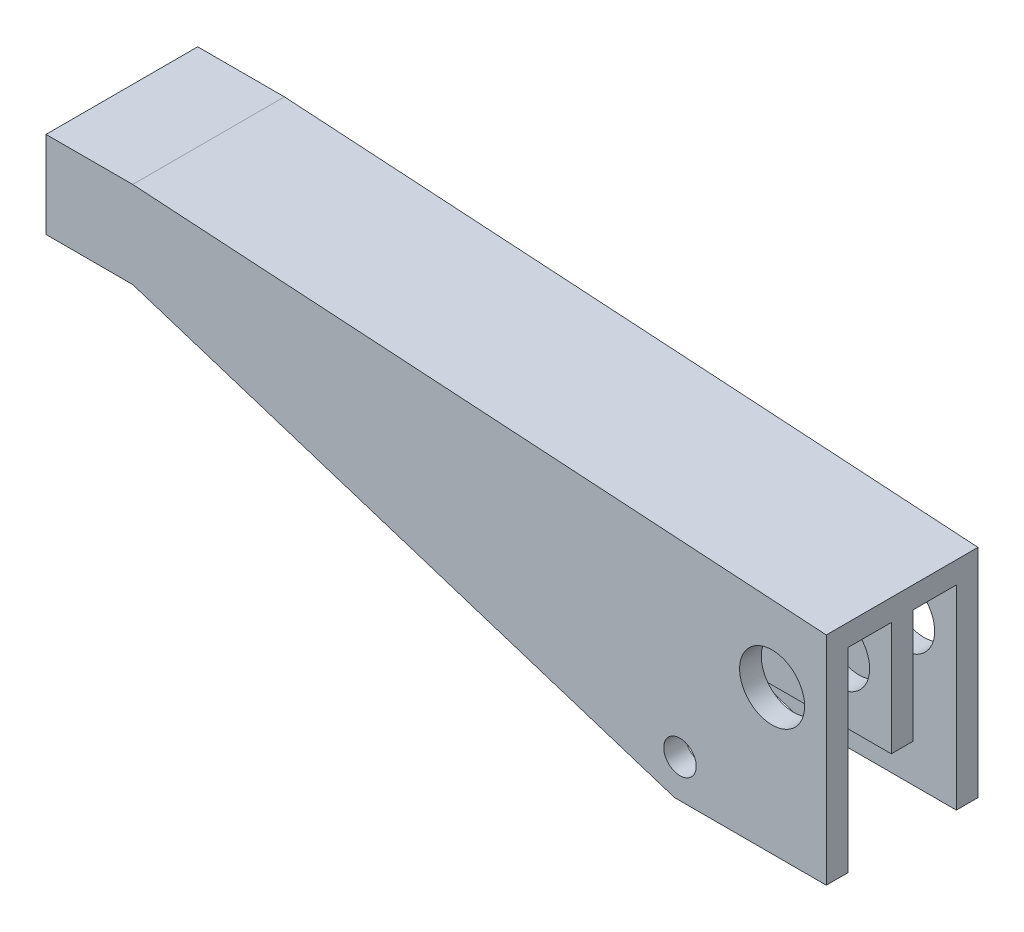
ISO-10303-21;
HEADER;
FILE_DESCRIPTION(('STEP AP214'),'2;1');
FILE_NAME('part.step','',(''),(''),'','','');
FILE_SCHEMA(('AUTOMOTIVE_DESIGN { 1 0 10303 214 1 1 1 1 }'));
ENDSEC;
DATA;
#1=APPLICATION_CONTEXT('core data for automotive mechanical design processes');
#2=APPLICATION_PROTOCOL_DEFINITION('international standard','automotive_design',2000,#1);
#3=PRODUCT_CONTEXT('',#1,'mechanical');
#4=PRODUCT('Part','Part','',(#3));
#5=PRODUCT_RELATED_PRODUCT_CATEGORY('part','',(#4));
#6=PRODUCT_DEFINITION_FORMATION('','',#4);
#7=PRODUCT_DEFINITION_CONTEXT('part definition',#1,'design');
#8=PRODUCT_DEFINITION('design','',#6,#7);
#9=PRODUCT_DEFINITION_SHAPE('','',#8);
#10=(LENGTH_UNIT() NAMED_UNIT(*) SI_UNIT(.MILLI.,.METRE.));
#11=(NAMED_UNIT(*) PLANE_ANGLE_UNIT() SI_UNIT($,.RADIAN.));
#12=(NAMED_UNIT(*) SI_UNIT($,.STERADIAN.) SOLID_ANGLE_UNIT());
#13=UNCERTAINTY_MEASURE_WITH_UNIT(LENGTH_MEASURE(1.E-05),#10,'distance_accuracy_value','');
#14=(GEOMETRIC_REPRESENTATION_CONTEXT(3) GLOBAL_UNCERTAINTY_ASSIGNED_CONTEXT((#13)) GLOBAL_UNIT_ASSIGNED_CONTEXT((#10,
#11,#12)) REPRESENTATION_CONTEXT('',''));
#15=CARTESIAN_POINT('',(0.,0.,0.));
#16=DIRECTION('',(0.,0.,1.));
#17=DIRECTION('',(1.,0.,0.));
#18=AXIS2_PLACEMENT_3D('',#15,#16,#17);
#19=CARTESIAN_POINT('',(682.208658532502,291.408058522125,-2722.74909230805));
#20=DIRECTION('',(-0.0623782861551791,-0.998052578482889,0.));
#21=DIRECTION('',(0.998052578482889,-0.0623782861551791,0.));
#22=AXIS2_PLACEMENT_3D('',#19,#20,#21);
#23=PLANE('',#22);
#24=DIRECTION('',(0.,0.,1.));
#25=VECTOR('',#24,1.);
#26=CARTESIAN_POINT('',(754.344658532502,286.899558522125,-2722.74909230805));
#27=LINE('',#26,#25);
#28=CARTESIAN_POINT('',(754.344658532502,286.899558522125,-116.84));
#29=VERTEX_POINT('',#28);
#30=CARTESIAN_POINT('',(754.344658532502,286.899558522125,27.4319999999999));
#31=VERTEX_POINT('',#30);
#32=EDGE_CURVE('E271',#29,#31,#27,.T.);
#33=ORIENTED_EDGE('',*,*,#32,.T.);
#34=DIRECTION('',(-0.998052578482889,0.0623782861551791,0.));
#35=VECTOR('',#34,1.);
#36=CARTESIAN_POINT('',(682.208658532502,291.408058522125,27.4319999999999));
#37=LINE('',#36,#35);
#38=CARTESIAN_POINT('',(-1556.25939434065,431.312311826698,27.4319999999999));
#39=VERTEX_POINT('',#38);
#40=EDGE_CURVE('E229',#31,#39,#37,.T.);
#41=ORIENTED_EDGE('',*,*,#40,.T.);
#42=DIRECTION('',(0.,0.,1.));
#43=VECTOR('',#42,1.);
#44=CARTESIAN_POINT('',(-1556.25939434065,431.312311826698,-2722.74909230805));
#45=LINE('',#44,#43);
#46=CARTESIAN_POINT('',(-1556.25939434065,431.312311826698,-116.84));
#47=VERTEX_POINT('',#46);
#48=EDGE_CURVE('E289',#47,#39,#45,.T.);
#49=ORIENTED_EDGE('',*,*,#48,.F.);
#50=DIRECTION('',(-0.998052578482889,0.0623782861551791,0.));
#51=VECTOR('',#50,1.);
#52=CARTESIAN_POINT('',(682.208658532502,291.408058522125,-116.84));
#53=LINE('',#52,#51);
#54=EDGE_CURVE('E270',#29,#47,#53,.T.);
#55=ORIENTED_EDGE('',*,*,#54,.F.);
#56=EDGE_LOOP('',(#33,#41,#49,#55));
#57=FACE_BOUND('',#56,.T.);
#58=ADVANCED_FACE('F37',(#57),#23,.T.);
#59=CARTESIAN_POINT('',(-1556.25939434065,431.312311826698,-2722.74909230805));
#60=DIRECTION('',(0.,-1.,0.));
#61=DIRECTION('',(1.,0.,0.));
#62=AXIS2_PLACEMENT_3D('',#59,#60,#61);
#63=PLANE('',#62);
#64=ORIENTED_EDGE('',*,*,#48,.T.);
#65=DIRECTION('',(-1.,0.,0.));
#66=VECTOR('',#65,1.);
#67=CARTESIAN_POINT('',(-1556.25939434065,431.312311826698,27.4319999999999));
#68=LINE('',#67,#66);
#69=CARTESIAN_POINT('',(-1842.5513414675,431.312311826697,27.4319999999999));
#70=VERTEX_POINT('',#69);
#71=EDGE_CURVE('E227',#39,#70,#68,.T.);
#72=ORIENTED_EDGE('',*,*,#71,.T.);
#73=DIRECTION('',(0.,0.,1.));
#74=VECTOR('',#73,1.);
#75=CARTESIAN_POINT('',(-1842.5513414675,431.312311826697,-2722.74909230805));
#76=LINE('',#75,#74);
#77=CARTESIAN_POINT('',(-1842.5513414675,431.312311826697,-116.84));
#78=VERTEX_POINT('',#77);
#79=EDGE_CURVE('E293',#78,#70,#76,.T.);
#80=ORIENTED_EDGE('',*,*,#79,.F.);
#81=DIRECTION('',(-1.,0.,0.));
#82=VECTOR('',#81,1.);
#83=CARTESIAN_POINT('',(-1556.25939434065,431.312311826698,-116.84));
#84=LINE('',#83,#82);
#85=EDGE_CURVE('E267',#47,#78,#84,.T.);
#86=ORIENTED_EDGE('',*,*,#85,.F.);
#87=EDGE_LOOP('',(#64,#72,#80,#86));
#88=FACE_BOUND('',#87,.T.);
#89=ADVANCED_FACE('F356',(#88),#63,.T.);
#90=DIRECTION('',(-0.998052578482889,0.0623782861551791,0.));
#91=VECTOR('',#90,1.);
#92=CARTESIAN_POINT('',(682.208658532502,291.408058522125,99.5680000000002));
#93=LINE('',#92,#91);
#94=CARTESIAN_POINT('',(754.344658532502,286.899558522125,99.5679999999999));
#95=VERTEX_POINT('',#94);
#96=CARTESIAN_POINT('',(-1556.25939434065,431.312311826698,99.5680000000002));
#97=VERTEX_POINT('',#96);
#98=EDGE_CURVE('E224',#95,#97,#93,.T.);
#99=ORIENTED_EDGE('',*,*,#98,.F.);
#100=CARTESIAN_POINT('',(754.344658532502,286.899558522125,243.84));
#101=VERTEX_POINT('',#100);
#102=EDGE_CURVE('E288',#95,#101,#27,.T.);
#103=ORIENTED_EDGE('',*,*,#102,.T.);
#104=DIRECTION('',(-0.998052578482889,0.0623782861551791,0.));
#105=VECTOR('',#104,1.);
#106=CARTESIAN_POINT('',(682.208658532502,291.408058522125,243.84));
#107=LINE('',#106,#105);
#108=CARTESIAN_POINT('',(-1556.25939434065,431.312311826698,243.84));
#109=VERTEX_POINT('',#108);
#110=EDGE_CURVE('E263',#101,#109,#107,.T.);
#111=ORIENTED_EDGE('',*,*,#110,.T.);
#112=EDGE_CURVE('E292',#97,#109,#45,.T.);
#113=ORIENTED_EDGE('',*,*,#112,.F.);
#114=EDGE_LOOP('',(#99,#103,#111,#113));
#115=FACE_BOUND('',#114,.T.);
#116=ADVANCED_FACE('F411',(#115),#23,.T.);
#117=DIRECTION('',(-1.,0.,0.));
#118=VECTOR('',#117,1.);
#119=CARTESIAN_POINT('',(-1556.25939434065,431.312311826698,99.5680000000002));
#120=LINE('',#119,#118);
#121=CARTESIAN_POINT('',(-1842.5513414675,431.312311826697,99.5680000000001));
#122=VERTEX_POINT('',#121);
#123=EDGE_CURVE('E61',#97,#122,#120,.T.);
#124=ORIENTED_EDGE('',*,*,#123,.F.);
#125=ORIENTED_EDGE('',*,*,#112,.T.);
#126=DIRECTION('',(-1.,0.,0.));
#127=VECTOR('',#126,1.);
#128=CARTESIAN_POINT('',(-1556.25939434065,431.312311826698,243.84));
#129=LINE('',#128,#127);
#130=CARTESIAN_POINT('',(-1842.5513414675,431.312311826697,243.84));
#131=VERTEX_POINT('',#130);
#132=EDGE_CURVE('E11',#109,#131,#129,.T.);
#133=ORIENTED_EDGE('',*,*,#132,.T.);
#134=EDGE_CURVE('E285',#122,#131,#76,.T.);
#135=ORIENTED_EDGE('',*,*,#134,.F.);
#136=EDGE_LOOP('',(#124,#125,#133,#135));
#137=FACE_BOUND('',#136,.T.);
#138=ADVANCED_FACE('F403',(#137),#63,.T.);
#139=CARTESIAN_POINT('',(754.344658532502,-362.183688173303,-116.84));
#140=DIRECTION('',(0.,0.,1.));
#141=DIRECTION('',(1.,0.,0.));
#142=AXIS2_PLACEMENT_3D('',#139,#140,#141);
#143=PLANE('',#142);
#144=CARTESIAN_POINT('',(267.426658532502,-235.945688173303,-116.84));
#145=DIRECTION('',(0.,0.,1.));
#146=DIRECTION('',(1.,0.,0.));
#147=AXIS2_PLACEMENT_3D('',#144,#145,#146);
#148=CIRCLE('',#147,54.102);
#149=CARTESIAN_POINT('',(321.528658532502,-235.945688173303,-116.84));
#150=VERTEX_POINT('',#149);
#151=EDGE_CURVE('E382',#150,#150,#148,.T.);
#152=ORIENTED_EDGE('',*,*,#151,.F.);
#153=EDGE_LOOP('',(#152));
#154=FACE_BOUND('',#153,.T.);
#155=CARTESIAN_POINT('',(574.004658532502,117.690055217553,-116.84));
#156=DIRECTION('',(0.,0.,1.));
#157=DIRECTION('',(1.,0.,0.));
#158=AXIS2_PLACEMENT_3D('',#155,#156,#157);
#159=CIRCLE('',#158,108.204);
#160=CARTESIAN_POINT('',(682.208658532502,117.690055217553,-116.84));
#161=VERTEX_POINT('',#160);
#162=EDGE_CURVE('E205',#161,#161,#159,.T.);
#163=ORIENTED_EDGE('',*,*,#162,.F.);
#164=EDGE_LOOP('',(#163));
#165=FACE_BOUND('',#164,.T.);
#166=DIRECTION('',(0.,1.,0.));
#167=VECTOR('',#166,1.);
#168=CARTESIAN_POINT('',(754.344658532502,-362.183688173303,-116.84));
#169=LINE('',#168,#167);
#170=CARTESIAN_POINT('',(754.344658532502,-362.183688173303,-116.84));
#171=VERTEX_POINT('',#170);
#172=EDGE_CURVE('E300',#171,#29,#169,.T.);
#173=ORIENTED_EDGE('',*,*,#172,.T.);
#174=ORIENTED_EDGE('',*,*,#54,.T.);
#175=ORIENTED_EDGE('',*,*,#85,.T.);
#176=DIRECTION('',(0.,-1.,0.));
#177=VECTOR('',#176,1.);
#178=CARTESIAN_POINT('',(-1842.5513414675,503.448311826697,-116.84));
#179=LINE('',#178,#177);
#180=CARTESIAN_POINT('',(-1842.5513414675,214.904311826697,-116.84));
#181=VERTEX_POINT('',#180);
#182=EDGE_CURVE('E274',#78,#181,#179,.T.);
#183=ORIENTED_EDGE('',*,*,#182,.T.);
#184=DIRECTION('',(1.,0.,0.));
#185=VECTOR('',#184,1.);
#186=CARTESIAN_POINT('',(-1842.5513414675,214.904311826697,-116.84));
#187=LINE('',#186,#185);
#188=CARTESIAN_POINT('',(-1554.0073414675,214.904311826697,-116.84));
#189=VERTEX_POINT('',#188);
#190=EDGE_CURVE('E320',#181,#189,#187,.T.);
#191=ORIENTED_EDGE('',*,*,#190,.T.);
#192=DIRECTION('',(0.952424147199324,-0.304775727103784,0.));
#193=VECTOR('',#192,1.);
#194=CARTESIAN_POINT('',(-1554.0073414675,214.904311826697,-116.84));
#195=LINE('',#194,#193);
#196=CARTESIAN_POINT('',(249.392658532502,-362.183688173303,-116.84));
#197=VERTEX_POINT('',#196);
#198=EDGE_CURVE('E323',#189,#197,#195,.T.);
#199=ORIENTED_EDGE('',*,*,#198,.T.);
#200=DIRECTION('',(1.,0.,0.));
#201=VECTOR('',#200,1.);
#202=CARTESIAN_POINT('',(249.392658532502,-362.183688173303,-116.84));
#203=LINE('',#202,#201);
#204=EDGE_CURVE('E326',#197,#171,#203,.T.);
#205=ORIENTED_EDGE('',*,*,#204,.T.);
#206=EDGE_LOOP('',(#173,#174,#175,#183,#191,#199,#205));
#207=FACE_BOUND('',#206,.T.);
#208=ADVANCED_FACE('F353',(#154,#165,#207),#143,.T.);
#209=CARTESIAN_POINT('',(-1842.5513414675,503.448311826697,-188.976));
#210=DIRECTION('',(-1.,0.,0.));
#211=DIRECTION('',(0.,0.,1.));
#212=AXIS2_PLACEMENT_3D('',#209,#210,#211);
#213=PLANE('',#212);
#214=DIRECTION('',(0.,-1.,0.));
#215=VECTOR('',#214,1.);
#216=CARTESIAN_POINT('',(-1842.5513414675,431.312311826697,315.976));
#217=LINE('',#216,#215);
#218=CARTESIAN_POINT('',(-1842.5513414675,503.448311826697,315.976));
#219=VERTEX_POINT('',#218);
#220=CARTESIAN_POINT('',(-1842.5513414675,214.904311826697,315.976));
#221=VERTEX_POINT('',#220);
#222=EDGE_CURVE('E277',#219,#221,#217,.T.);
#223=ORIENTED_EDGE('',*,*,#222,.F.);
#224=DIRECTION('',(0.,0.,1.));
#225=VECTOR('',#224,1.);
#226=CARTESIAN_POINT('',(-1842.5513414675,503.448311826697,-188.976));
#227=LINE('',#226,#225);
#228=CARTESIAN_POINT('',(-1842.5513414675,503.448311826697,-188.976));
#229=VERTEX_POINT('',#228);
#230=EDGE_CURVE('E46',#229,#219,#227,.T.);
#231=ORIENTED_EDGE('',*,*,#230,.F.);
#232=DIRECTION('',(0.,-1.,0.));
#233=VECTOR('',#232,1.);
#234=CARTESIAN_POINT('',(-1842.5513414675,503.448311826697,-188.976));
#235=LINE('',#234,#233);
#236=CARTESIAN_POINT('',(-1842.5513414675,214.904311826697,-188.976));
#237=VERTEX_POINT('',#236);
#238=EDGE_CURVE('E296',#229,#237,#235,.T.);
#239=ORIENTED_EDGE('',*,*,#238,.T.);
#240=DIRECTION('',(0.,0.,1.));
#241=VECTOR('',#240,1.);
#242=CARTESIAN_POINT('',(-1842.5513414675,214.904311826697,-188.976));
#243=LINE('',#242,#241);
#244=EDGE_CURVE('E318',#237,#181,#243,.T.);
#245=ORIENTED_EDGE('',*,*,#244,.T.);
#246=ORIENTED_EDGE('',*,*,#182,.F.);
#247=ORIENTED_EDGE('',*,*,#79,.T.);
#248=DIRECTION('',(0.,-1.,0.));
#249=VECTOR('',#248,1.);
#250=CARTESIAN_POINT('',(-1842.5513414675,503.448311826697,27.432));
#251=LINE('',#250,#249);
#252=CARTESIAN_POINT('',(-1842.5513414675,214.904311826697,27.432));
#253=VERTEX_POINT('',#252);
#254=EDGE_CURVE('E216',#70,#253,#251,.T.);
#255=ORIENTED_EDGE('',*,*,#254,.T.);
#256=DIRECTION('',(0.,0.,1.));
#257=VECTOR('',#256,1.);
#258=CARTESIAN_POINT('',(-1842.5513414675,214.904311826697,27.432));
#259=LINE('',#258,#257);
#260=CARTESIAN_POINT('',(-1842.5513414675,214.904311826697,99.5680000000001));
#261=VERTEX_POINT('',#260);
#262=EDGE_CURVE('E219',#253,#261,#259,.T.);
#263=ORIENTED_EDGE('',*,*,#262,.T.);
#264=DIRECTION('',(0.,-1.,0.));
#265=VECTOR('',#264,1.);
#266=CARTESIAN_POINT('',(-1842.5513414675,503.448311826697,99.5680000000001));
#267=LINE('',#266,#265);
#268=EDGE_CURVE('E203',#122,#261,#267,.T.);
#269=ORIENTED_EDGE('',*,*,#268,.F.);
#270=ORIENTED_EDGE('',*,*,#134,.T.);
#271=DIRECTION('',(0.,-1.,0.));
#272=VECTOR('',#271,1.);
#273=CARTESIAN_POINT('',(-1842.5513414675,503.448311826697,243.84));
#274=LINE('',#273,#272);
#275=CARTESIAN_POINT('',(-1842.5513414675,214.904311826697,243.84));
#276=VERTEX_POINT('',#275);
#277=EDGE_CURVE('E236',#131,#276,#274,.T.);
#278=ORIENTED_EDGE('',*,*,#277,.T.);
#279=DIRECTION('',(0.,0.,-1.));
#280=VECTOR('',#279,1.);
#281=CARTESIAN_POINT('',(-1842.5513414675,214.904311826697,315.976));
#282=LINE('',#281,#280);
#283=EDGE_CURVE('E241',#221,#276,#282,.T.);
#284=ORIENTED_EDGE('',*,*,#283,.F.);
#285=EDGE_LOOP('',(#223,#231,#239,#245,#246,#247,#255,#263,#269,#270,#278,#284));
#286=FACE_BOUND('',#285,.T.);
#287=ADVANCED_FACE('F39',(#286),#213,.T.);
#288=CARTESIAN_POINT('',(-1842.5513414675,503.448311826697,-188.976));
#289=DIRECTION('',(0.,1.,0.));
#290=DIRECTION('',(-1.,0.,0.));
#291=AXIS2_PLACEMENT_3D('',#288,#289,#290);
#292=PLANE('',#291);
#293=DIRECTION('',(-1.,0.,0.));
#294=VECTOR('',#293,1.);
#295=CARTESIAN_POINT('',(-1842.5513414675,503.448311826697,315.976));
#296=LINE('',#295,#294);
#297=CARTESIAN_POINT('',(-1554.0073414675,503.448311826697,315.976));
#298=VERTEX_POINT('',#297);
#299=EDGE_CURVE('E266',#298,#219,#296,.T.);
#300=ORIENTED_EDGE('',*,*,#299,.F.);
#301=DIRECTION('',(0.,0.,1.));
#302=VECTOR('',#301,1.);
#303=CARTESIAN_POINT('',(-1554.0073414675,503.448311826697,-188.976));
#304=LINE('',#303,#302);
#305=CARTESIAN_POINT('',(-1554.0073414675,503.448311826697,-188.976));
#306=VERTEX_POINT('',#305);
#307=EDGE_CURVE('E332',#306,#298,#304,.T.);
#308=ORIENTED_EDGE('',*,*,#307,.F.);
#309=DIRECTION('',(-1.,0.,0.));
#310=VECTOR('',#309,1.);
#311=CARTESIAN_POINT('',(-1842.5513414675,503.448311826697,-188.976));
#312=LINE('',#311,#310);
#313=EDGE_CURVE('E315',#306,#229,#312,.T.);
#314=ORIENTED_EDGE('',*,*,#313,.T.);
#315=ORIENTED_EDGE('',*,*,#230,.T.);
#316=EDGE_LOOP('',(#300,#308,#314,#315));
#317=FACE_BOUND('',#316,.T.);
#318=ADVANCED_FACE('F410',(#317),#292,.T.);
#319=CARTESIAN_POINT('',(754.344658532502,359.176311826697,-188.976));
#320=DIRECTION('',(0.0623782861551806,0.998052578482888,0.));
#321=DIRECTION('',(-0.998052578482889,0.0623782861551806,0.));
#322=AXIS2_PLACEMENT_3D('',#319,#320,#321);
#323=PLANE('',#322);
#324=DIRECTION('',(-0.998052578482889,0.0623782861551806,0.));
#325=VECTOR('',#324,1.);
#326=CARTESIAN_POINT('',(-1554.0073414675,503.448311826697,315.976));
#327=LINE('',#326,#325);
#328=CARTESIAN_POINT('',(754.344658532502,359.176311826697,315.976));
#329=VERTEX_POINT('',#328);
#330=EDGE_CURVE('E282',#329,#298,#327,.T.);
#331=ORIENTED_EDGE('',*,*,#330,.F.);
#332=DIRECTION('',(0.,0.,1.));
#333=VECTOR('',#332,1.);
#334=CARTESIAN_POINT('',(754.344658532502,359.176311826697,-188.976));
#335=LINE('',#334,#333);
#336=CARTESIAN_POINT('',(754.344658532502,359.176311826697,-188.976));
#337=VERTEX_POINT('',#336);
#338=EDGE_CURVE('E334',#337,#329,#335,.T.);
#339=ORIENTED_EDGE('',*,*,#338,.F.);
#340=DIRECTION('',(-0.998052578482889,0.0623782861551806,0.));
#341=VECTOR('',#340,1.);
#342=CARTESIAN_POINT('',(754.344658532502,359.176311826697,-188.976));
#343=LINE('',#342,#341);
#344=EDGE_CURVE('E312',#337,#306,#343,.T.);
#345=ORIENTED_EDGE('',*,*,#344,.T.);
#346=ORIENTED_EDGE('',*,*,#307,.T.);
#347=EDGE_LOOP('',(#331,#339,#345,#346));
#348=FACE_BOUND('',#347,.T.);
#349=ADVANCED_FACE('F459',(#348),#323,.T.);
#350=CARTESIAN_POINT('',(754.344658532502,-362.183688173303,-188.976));
#351=DIRECTION('',(1.,0.,0.));
#352=DIRECTION('',(0.,0.,-1.));
#353=AXIS2_PLACEMENT_3D('',#350,#351,#352);
#354=PLANE('',#353);
#355=DIRECTION('',(0.,0.,1.));
#356=VECTOR('',#355,1.);
#357=CARTESIAN_POINT('',(754.344658532502,-91.6736881733026,-1349.69336559605));
#358=LINE('',#357,#356);
#359=CARTESIAN_POINT('',(754.344658532502,-91.6736881733026,27.4320000000001));
#360=VERTEX_POINT('',#359);
#361=CARTESIAN_POINT('',(754.344658532502,-91.6736881733026,99.5680000000001));
#362=VERTEX_POINT('',#361);
#363=EDGE_CURVE('E53',#360,#362,#358,.T.);
#364=ORIENTED_EDGE('',*,*,#363,.F.);
#365=DIRECTION('',(0.,1.,0.));
#366=VECTOR('',#365,1.);
#367=CARTESIAN_POINT('',(754.344658532502,-362.183688173303,27.432));
#368=LINE('',#367,#366);
#369=EDGE_CURVE('E214',#360,#31,#368,.T.);
#370=ORIENTED_EDGE('',*,*,#369,.T.);
#371=ORIENTED_EDGE('',*,*,#32,.F.);
#372=ORIENTED_EDGE('',*,*,#172,.F.);
#373=DIRECTION('',(0.,0.,1.));
#374=VECTOR('',#373,1.);
#375=CARTESIAN_POINT('',(754.344658532502,-362.183688173303,-188.976));
#376=LINE('',#375,#374);
#377=CARTESIAN_POINT('',(754.344658532502,-362.183688173303,-188.976));
#378=VERTEX_POINT('',#377);
#379=EDGE_CURVE('E336',#378,#171,#376,.T.);
#380=ORIENTED_EDGE('',*,*,#379,.F.);
#381=DIRECTION('',(0.,1.,0.));
#382=VECTOR('',#381,1.);
#383=CARTESIAN_POINT('',(754.344658532502,-362.183688173303,-188.976));
#384=LINE('',#383,#382);
#385=EDGE_CURVE('E309',#378,#337,#384,.T.);
#386=ORIENTED_EDGE('',*,*,#385,.T.);
#387=ORIENTED_EDGE('',*,*,#338,.T.);
#388=DIRECTION('',(0.,1.,0.));
#389=VECTOR('',#388,1.);
#390=CARTESIAN_POINT('',(754.344658532502,286.899558522125,315.976));
#391=LINE('',#390,#389);
#392=CARTESIAN_POINT('',(754.344658532502,-362.183688173303,315.976));
#393=VERTEX_POINT('',#392);
#394=EDGE_CURVE('E279',#393,#329,#391,.T.);
#395=ORIENTED_EDGE('',*,*,#394,.F.);
#396=DIRECTION('',(0.,0.,-1.));
#397=VECTOR('',#396,1.);
#398=CARTESIAN_POINT('',(754.344658532502,-362.183688173303,315.976));
#399=LINE('',#398,#397);
#400=CARTESIAN_POINT('',(754.344658532502,-362.183688173303,243.84));
#401=VERTEX_POINT('',#400);
#402=EDGE_CURVE('E254',#393,#401,#399,.T.);
#403=ORIENTED_EDGE('',*,*,#402,.T.);
#404=DIRECTION('',(0.,1.,0.));
#405=VECTOR('',#404,1.);
#406=CARTESIAN_POINT('',(754.344658532502,-362.183688173303,243.84));
#407=LINE('',#406,#405);
#408=EDGE_CURVE('E248',#401,#101,#407,.T.);
#409=ORIENTED_EDGE('',*,*,#408,.T.);
#410=ORIENTED_EDGE('',*,*,#102,.F.);
#411=DIRECTION('',(0.,1.,0.));
#412=VECTOR('',#411,1.);
#413=CARTESIAN_POINT('',(754.344658532502,-362.183688173303,99.5680000000001));
#414=LINE('',#413,#412);
#415=EDGE_CURVE('E201',#362,#95,#414,.T.);
#416=ORIENTED_EDGE('',*,*,#415,.F.);
#417=EDGE_LOOP('',(#364,#370,#371,#372,#380,#386,#387,#395,#403,#409,#410,#416));
#418=FACE_BOUND('',#417,.T.);
#419=ADVANCED_FACE('F430',(#418),#354,.T.);
#420=CARTESIAN_POINT('',(249.392658532502,-362.183688173303,-188.976));
#421=DIRECTION('',(0.,-1.,0.));
#422=DIRECTION('',(0.,0.,-1.));
#423=AXIS2_PLACEMENT_3D('',#420,#421,#422);
#424=PLANE('',#423);
#425=ORIENTED_EDGE('',*,*,#204,.F.);
#426=DIRECTION('',(0.,0.,1.));
#427=VECTOR('',#426,1.);
#428=CARTESIAN_POINT('',(249.392658532502,-362.183688173303,-188.976));
#429=LINE('',#428,#427);
#430=CARTESIAN_POINT('',(249.392658532502,-362.183688173303,-188.976));
#431=VERTEX_POINT('',#430);
#432=EDGE_CURVE('E338',#431,#197,#429,.T.);
#433=ORIENTED_EDGE('',*,*,#432,.F.);
#434=DIRECTION('',(1.,0.,0.));
#435=VECTOR('',#434,1.);
#436=CARTESIAN_POINT('',(249.392658532502,-362.183688173303,-188.976));
#437=LINE('',#436,#435);
#438=EDGE_CURVE('E306',#431,#378,#437,.T.);
#439=ORIENTED_EDGE('',*,*,#438,.T.);
#440=ORIENTED_EDGE('',*,*,#379,.T.);
#441=EDGE_LOOP('',(#425,#433,#439,#440));
#442=FACE_BOUND('',#441,.T.);
#443=ADVANCED_FACE('F465',(#442),#424,.T.);
#444=CARTESIAN_POINT('',(-1554.0073414675,214.904311826697,-188.976));
#445=DIRECTION('',(-0.304775727103784,-0.952424147199324,0.));
#446=DIRECTION('',(0.952424147199324,-0.304775727103784,0.));
#447=AXIS2_PLACEMENT_3D('',#444,#445,#446);
#448=PLANE('',#447);
#449=ORIENTED_EDGE('',*,*,#198,.F.);
#450=DIRECTION('',(0.,0.,1.));
#451=VECTOR('',#450,1.);
#452=CARTESIAN_POINT('',(-1554.0073414675,214.904311826697,-188.976));
#453=LINE('',#452,#451);
#454=CARTESIAN_POINT('',(-1554.0073414675,214.904311826697,-188.976));
#455=VERTEX_POINT('',#454);
#456=EDGE_CURVE('E340',#455,#189,#453,.T.);
#457=ORIENTED_EDGE('',*,*,#456,.F.);
#458=DIRECTION('',(0.952424147199324,-0.304775727103784,0.));
#459=VECTOR('',#458,1.);
#460=CARTESIAN_POINT('',(-1554.0073414675,214.904311826697,-188.976));
#461=LINE('',#460,#459);
#462=EDGE_CURVE('E303',#455,#431,#461,.T.);
#463=ORIENTED_EDGE('',*,*,#462,.T.);
#464=ORIENTED_EDGE('',*,*,#432,.T.);
#465=EDGE_LOOP('',(#449,#457,#463,#464));
#466=FACE_BOUND('',#465,.T.);
#467=ADVANCED_FACE('F467',(#466),#448,.T.);
#468=CARTESIAN_POINT('',(-1842.5513414675,214.904311826697,-188.976));
#469=DIRECTION('',(0.,-1.,0.));
#470=DIRECTION('',(0.,0.,-1.));
#471=AXIS2_PLACEMENT_3D('',#468,#469,#470);
#472=PLANE('',#471);
#473=ORIENTED_EDGE('',*,*,#190,.F.);
#474=ORIENTED_EDGE('',*,*,#244,.F.);
#475=DIRECTION('',(1.,0.,0.));
#476=VECTOR('',#475,1.);
#477=CARTESIAN_POINT('',(-1842.5513414675,214.904311826697,-188.976));
#478=LINE('',#477,#476);
#479=EDGE_CURVE('E299',#237,#455,#478,.T.);
#480=ORIENTED_EDGE('',*,*,#479,.T.);
#481=ORIENTED_EDGE('',*,*,#456,.T.);
#482=EDGE_LOOP('',(#473,#474,#480,#481));
#483=FACE_BOUND('',#482,.T.);
#484=ADVANCED_FACE('F350',(#483),#472,.T.);
#485=CARTESIAN_POINT('',(754.344658532502,-362.183688173303,-188.976));
#486=DIRECTION('',(0.,0.,1.));
#487=DIRECTION('',(1.,0.,0.));
#488=AXIS2_PLACEMENT_3D('',#485,#486,#487);
#489=PLANE('',#488);
#490=CARTESIAN_POINT('',(267.426658532502,-235.945688173303,-188.976));
#491=DIRECTION('',(0.,0.,1.));
#492=DIRECTION('',(1.,0.,0.));
#493=AXIS2_PLACEMENT_3D('',#490,#491,#492);
#494=CIRCLE('',#493,54.102);
#495=CARTESIAN_POINT('',(321.528658532502,-235.945688173303,-188.976));
#496=VERTEX_POINT('',#495);
#497=EDGE_CURVE('E373',#496,#496,#494,.T.);
#498=ORIENTED_EDGE('',*,*,#497,.T.);
#499=EDGE_LOOP('',(#498));
#500=FACE_BOUND('',#499,.T.);
#501=CARTESIAN_POINT('',(574.004658532502,117.690055217553,-188.976));
#502=DIRECTION('',(0.,0.,1.));
#503=DIRECTION('',(1.,0.,0.));
#504=AXIS2_PLACEMENT_3D('',#501,#502,#503);
#505=CIRCLE('',#504,108.204);
#506=CARTESIAN_POINT('',(682.208658532502,117.690055217553,-188.976));
#507=VERTEX_POINT('',#506);
#508=EDGE_CURVE('E386',#507,#507,#505,.T.);
#509=ORIENTED_EDGE('',*,*,#508,.T.);
#510=EDGE_LOOP('',(#509));
#511=FACE_BOUND('',#510,.T.);
#512=ORIENTED_EDGE('',*,*,#238,.F.);
#513=ORIENTED_EDGE('',*,*,#313,.F.);
#514=ORIENTED_EDGE('',*,*,#344,.F.);
#515=ORIENTED_EDGE('',*,*,#385,.F.);
#516=ORIENTED_EDGE('',*,*,#438,.F.);
#517=ORIENTED_EDGE('',*,*,#462,.F.);
#518=ORIENTED_EDGE('',*,*,#479,.F.);
#519=EDGE_LOOP('',(#512,#513,#514,#515,#516,#517,#518));
#520=FACE_BOUND('',#519,.T.);
#521=ADVANCED_FACE('F454',(#500,#511,#520),#489,.F.);
#522=CARTESIAN_POINT('',(754.344658532502,-362.183688173303,315.976));
#523=DIRECTION('',(0.,0.,1.));
#524=DIRECTION('',(1.,0.,0.));
#525=AXIS2_PLACEMENT_3D('',#522,#523,#524);
#526=PLANE('',#525);
#527=CARTESIAN_POINT('',(267.426658532502,-235.945688173303,315.976));
#528=DIRECTION('',(0.,0.,1.));
#529=DIRECTION('',(1.,0.,0.));
#530=AXIS2_PLACEMENT_3D('',#527,#528,#529);
#531=CIRCLE('',#530,54.102);
#532=CARTESIAN_POINT('',(321.528658532502,-235.945688173303,315.976));
#533=VERTEX_POINT('',#532);
#534=EDGE_CURVE('E370',#533,#533,#531,.T.);
#535=ORIENTED_EDGE('',*,*,#534,.F.);
#536=EDGE_LOOP('',(#535));
#537=FACE_BOUND('',#536,.T.);
#538=CARTESIAN_POINT('',(574.004658532502,117.690055217553,315.976));
#539=DIRECTION('',(0.,0.,1.));
#540=DIRECTION('',(1.,0.,0.));
#541=AXIS2_PLACEMENT_3D('',#538,#539,#540);
#542=CIRCLE('',#541,108.204);
#543=CARTESIAN_POINT('',(682.208658532502,117.690055217553,315.976));
#544=VERTEX_POINT('',#543);
#545=EDGE_CURVE('E385',#544,#544,#542,.T.);
#546=ORIENTED_EDGE('',*,*,#545,.F.);
#547=EDGE_LOOP('',(#546));
#548=FACE_BOUND('',#547,.T.);
#549=DIRECTION('',(1.,0.,0.));
#550=VECTOR('',#549,1.);
#551=CARTESIAN_POINT('',(249.392658532502,-362.183688173303,315.976));
#552=LINE('',#551,#550);
#553=CARTESIAN_POINT('',(249.392658532502,-362.183688173303,315.976));
#554=VERTEX_POINT('',#553);
#555=EDGE_CURVE('E238',#554,#393,#552,.T.);
#556=ORIENTED_EDGE('',*,*,#555,.T.);
#557=ORIENTED_EDGE('',*,*,#394,.T.);
#558=ORIENTED_EDGE('',*,*,#330,.T.);
#559=ORIENTED_EDGE('',*,*,#299,.T.);
#560=ORIENTED_EDGE('',*,*,#222,.T.);
#561=DIRECTION('',(1.,0.,0.));
#562=VECTOR('',#561,1.);
#563=CARTESIAN_POINT('',(-1842.5513414675,214.904311826697,315.976));
#564=LINE('',#563,#562);
#565=CARTESIAN_POINT('',(-1554.0073414675,214.904311826697,315.976));
#566=VERTEX_POINT('',#565);
#567=EDGE_CURVE('E232',#221,#566,#564,.T.);
#568=ORIENTED_EDGE('',*,*,#567,.T.);
#569=DIRECTION('',(0.952424147199324,-0.304775727103784,0.));
#570=VECTOR('',#569,1.);
#571=CARTESIAN_POINT('',(-1554.0073414675,214.904311826697,315.976));
#572=LINE('',#571,#570);
#573=EDGE_CURVE('E235',#566,#554,#572,.T.);
#574=ORIENTED_EDGE('',*,*,#573,.T.);
#575=EDGE_LOOP('',(#556,#557,#558,#559,#560,#568,#574));
#576=FACE_BOUND('',#575,.T.);
#577=ADVANCED_FACE('F449',(#537,#548,#576),#526,.T.);
#578=CARTESIAN_POINT('',(-1842.5513414675,214.904311826697,315.976));
#579=DIRECTION('',(0.,1.,0.));
#580=DIRECTION('',(0.,0.,1.));
#581=AXIS2_PLACEMENT_3D('',#578,#579,#580);
#582=PLANE('',#581);
#583=DIRECTION('',(1.,0.,0.));
#584=VECTOR('',#583,1.);
#585=CARTESIAN_POINT('',(-1842.5513414675,214.904311826697,243.84));
#586=LINE('',#585,#584);
#587=CARTESIAN_POINT('',(-1554.0073414675,214.904311826697,243.84));
#588=VERTEX_POINT('',#587);
#589=EDGE_CURVE('E231',#276,#588,#586,.T.);
#590=ORIENTED_EDGE('',*,*,#589,.T.);
#591=DIRECTION('',(0.,0.,-1.));
#592=VECTOR('',#591,1.);
#593=CARTESIAN_POINT('',(-1554.0073414675,214.904311826697,315.976));
#594=LINE('',#593,#592);
#595=EDGE_CURVE('E260',#566,#588,#594,.T.);
#596=ORIENTED_EDGE('',*,*,#595,.F.);
#597=ORIENTED_EDGE('',*,*,#567,.F.);
#598=ORIENTED_EDGE('',*,*,#283,.T.);
#599=EDGE_LOOP('',(#590,#596,#597,#598));
#600=FACE_BOUND('',#599,.T.);
#601=ADVANCED_FACE('F442',(#600),#582,.F.);
#602=CARTESIAN_POINT('',(-1554.0073414675,214.904311826697,315.976));
#603=DIRECTION('',(0.304775727103784,0.952424147199324,0.));
#604=DIRECTION('',(-0.952424147199324,0.304775727103784,0.));
#605=AXIS2_PLACEMENT_3D('',#602,#603,#604);
#606=PLANE('',#605);
#607=DIRECTION('',(0.952424147199324,-0.304775727103784,0.));
#608=VECTOR('',#607,1.);
#609=CARTESIAN_POINT('',(-1554.0073414675,214.904311826697,243.84));
#610=LINE('',#609,#608);
#611=CARTESIAN_POINT('',(249.392658532502,-362.183688173303,243.84));
#612=VERTEX_POINT('',#611);
#613=EDGE_CURVE('E244',#588,#612,#610,.T.);
#614=ORIENTED_EDGE('',*,*,#613,.T.);
#615=DIRECTION('',(0.,0.,-1.));
#616=VECTOR('',#615,1.);
#617=CARTESIAN_POINT('',(249.392658532502,-362.183688173303,315.976));
#618=LINE('',#617,#616);
#619=EDGE_CURVE('E257',#554,#612,#618,.T.);
#620=ORIENTED_EDGE('',*,*,#619,.F.);
#621=ORIENTED_EDGE('',*,*,#573,.F.);
#622=ORIENTED_EDGE('',*,*,#595,.T.);
#623=EDGE_LOOP('',(#614,#620,#621,#622));
#624=FACE_BOUND('',#623,.T.);
#625=ADVANCED_FACE('F446',(#624),#606,.F.);
#626=CARTESIAN_POINT('',(249.392658532502,-362.183688173303,315.976));
#627=DIRECTION('',(0.,1.,0.));
#628=DIRECTION('',(0.,0.,1.));
#629=AXIS2_PLACEMENT_3D('',#626,#627,#628);
#630=PLANE('',#629);
#631=DIRECTION('',(1.,0.,0.));
#632=VECTOR('',#631,1.);
#633=CARTESIAN_POINT('',(249.392658532502,-362.183688173303,243.84));
#634=LINE('',#633,#632);
#635=EDGE_CURVE('E246',#612,#401,#634,.T.);
#636=ORIENTED_EDGE('',*,*,#635,.T.);
#637=ORIENTED_EDGE('',*,*,#402,.F.);
#638=ORIENTED_EDGE('',*,*,#555,.F.);
#639=ORIENTED_EDGE('',*,*,#619,.T.);
#640=EDGE_LOOP('',(#636,#637,#638,#639));
#641=FACE_BOUND('',#640,.T.);
#642=ADVANCED_FACE('F544',(#641),#630,.F.);
#643=CARTESIAN_POINT('',(754.344658532502,-362.183688173303,243.84));
#644=DIRECTION('',(0.,0.,1.));
#645=DIRECTION('',(1.,0.,0.));
#646=AXIS2_PLACEMENT_3D('',#643,#644,#645);
#647=PLANE('',#646);
#648=CARTESIAN_POINT('',(267.426658532502,-235.945688173303,243.84));
#649=DIRECTION('',(0.,0.,1.));
#650=DIRECTION('',(1.,0.,0.));
#651=AXIS2_PLACEMENT_3D('',#648,#649,#650);
#652=CIRCLE('',#651,54.102);
#653=CARTESIAN_POINT('',(321.528658532502,-235.945688173303,243.84));
#654=VERTEX_POINT('',#653);
#655=EDGE_CURVE('E378',#654,#654,#652,.T.);
#656=ORIENTED_EDGE('',*,*,#655,.T.);
#657=EDGE_LOOP('',(#656));
#658=FACE_BOUND('',#657,.T.);
#659=CARTESIAN_POINT('',(574.004658532502,117.690055217553,243.84));
#660=DIRECTION('',(0.,0.,1.));
#661=DIRECTION('',(1.,0.,0.));
#662=AXIS2_PLACEMENT_3D('',#659,#660,#661);
#663=CIRCLE('',#662,108.204);
#664=CARTESIAN_POINT('',(682.208658532502,117.690055217553,243.84));
#665=VERTEX_POINT('',#664);
#666=EDGE_CURVE('E394',#665,#665,#663,.T.);
#667=ORIENTED_EDGE('',*,*,#666,.T.);
#668=EDGE_LOOP('',(#667));
#669=FACE_BOUND('',#668,.T.);
#670=ORIENTED_EDGE('',*,*,#110,.F.);
#671=ORIENTED_EDGE('',*,*,#408,.F.);
#672=ORIENTED_EDGE('',*,*,#635,.F.);
#673=ORIENTED_EDGE('',*,*,#613,.F.);
#674=ORIENTED_EDGE('',*,*,#589,.F.);
#675=ORIENTED_EDGE('',*,*,#277,.F.);
#676=ORIENTED_EDGE('',*,*,#132,.F.);
#677=EDGE_LOOP('',(#670,#671,#672,#673,#674,#675,#676));
#678=FACE_BOUND('',#677,.T.);
#679=ADVANCED_FACE('F435',(#658,#669,#678),#647,.F.);
#680=CARTESIAN_POINT('',(-1842.5513414675,214.904311826697,27.432));
#681=DIRECTION('',(0.,-1.,0.));
#682=DIRECTION('',(0.,0.,-1.));
#683=AXIS2_PLACEMENT_3D('',#680,#681,#682);
#684=PLANE('',#683);
#685=DIRECTION('',(0.,0.,1.));
#686=VECTOR('',#685,1.);
#687=CARTESIAN_POINT('',(-1554.0073414675,214.904311826697,27.432));
#688=LINE('',#687,#686);
#689=CARTESIAN_POINT('',(-1554.0073414675,214.904311826697,27.432));
#690=VERTEX_POINT('',#689);
#691=CARTESIAN_POINT('',(-1554.0073414675,214.904311826697,99.5680000000001));
#692=VERTEX_POINT('',#691);
#693=EDGE_CURVE('E218',#690,#692,#688,.T.);
#694=ORIENTED_EDGE('',*,*,#693,.T.);
#695=DIRECTION('',(1.,0.,0.));
#696=VECTOR('',#695,1.);
#697=CARTESIAN_POINT('',(-1842.5513414675,214.904311826697,99.5680000000001));
#698=LINE('',#697,#696);
#699=EDGE_CURVE('E200',#261,#692,#698,.T.);
#700=ORIENTED_EDGE('',*,*,#699,.F.);
#701=ORIENTED_EDGE('',*,*,#262,.F.);
#702=DIRECTION('',(1.,0.,0.));
#703=VECTOR('',#702,1.);
#704=CARTESIAN_POINT('',(-1842.5513414675,214.904311826697,27.432));
#705=LINE('',#704,#703);
#706=EDGE_CURVE('E210',#253,#690,#705,.T.);
#707=ORIENTED_EDGE('',*,*,#706,.T.);
#708=EDGE_LOOP('',(#694,#700,#701,#707));
#709=FACE_BOUND('',#708,.T.);
#710=ADVANCED_FACE('F369',(#709),#684,.T.);
#711=CARTESIAN_POINT('',(-1554.0073414675,214.904311826697,27.432));
#712=DIRECTION('',(-0.304775727103784,-0.952424147199324,0.));
#713=DIRECTION('',(0.952424147199324,-0.304775727103784,0.));
#714=AXIS2_PLACEMENT_3D('',#711,#712,#713);
#715=PLANE('',#714);
#716=DIRECTION('',(0.,0.,1.));
#717=VECTOR('',#716,1.);
#718=CARTESIAN_POINT('',(-595.951091467498,-91.6736881733026,-1349.69336559605));
#719=LINE('',#718,#717);
#720=CARTESIAN_POINT('',(-595.951091467498,-91.6736881733026,27.4320000000001));
#721=VERTEX_POINT('',#720);
#722=CARTESIAN_POINT('',(-595.951091467498,-91.6736881733026,99.5680000000001));
#723=VERTEX_POINT('',#722);
#724=EDGE_CURVE('E181',#721,#723,#719,.T.);
#725=ORIENTED_EDGE('',*,*,#724,.T.);
#726=DIRECTION('',(0.952424147199324,-0.304775727103784,0.));
#727=VECTOR('',#726,1.);
#728=CARTESIAN_POINT('',(-1554.0073414675,214.904311826697,99.5680000000001));
#729=LINE('',#728,#727);
#730=EDGE_CURVE('E191',#692,#723,#729,.T.);
#731=ORIENTED_EDGE('',*,*,#730,.F.);
#732=ORIENTED_EDGE('',*,*,#693,.F.);
#733=DIRECTION('',(0.952424147199324,-0.304775727103784,0.));
#734=VECTOR('',#733,1.);
#735=CARTESIAN_POINT('',(-1554.0073414675,214.904311826697,27.432));
#736=LINE('',#735,#734);
#737=EDGE_CURVE('E194',#690,#721,#736,.T.);
#738=ORIENTED_EDGE('',*,*,#737,.T.);
#739=EDGE_LOOP('',(#725,#731,#732,#738));
#740=FACE_BOUND('',#739,.T.);
#741=ADVANCED_FACE('F190',(#740),#715,.T.);
#742=CARTESIAN_POINT('',(754.344658532502,-362.183688173303,27.432));
#743=DIRECTION('',(0.,0.,1.));
#744=DIRECTION('',(1.,0.,0.));
#745=AXIS2_PLACEMENT_3D('',#742,#743,#744);
#746=PLANE('',#745);
#747=CARTESIAN_POINT('',(574.004658532502,117.690055217553,27.432));
#748=DIRECTION('',(0.,0.,1.));
#749=DIRECTION('',(1.,0.,0.));
#750=AXIS2_PLACEMENT_3D('',#747,#748,#749);
#751=CIRCLE('',#750,108.204);
#752=CARTESIAN_POINT('',(682.208658532502,117.690055217553,27.432));
#753=VERTEX_POINT('',#752);
#754=EDGE_CURVE('E391',#753,#753,#751,.T.);
#755=ORIENTED_EDGE('',*,*,#754,.T.);
#756=EDGE_LOOP('',(#755));
#757=FACE_BOUND('',#756,.T.);
#758=ORIENTED_EDGE('',*,*,#369,.F.);
#759=DIRECTION('',(1.,0.,0.));
#760=VECTOR('',#759,1.);
#761=CARTESIAN_POINT('',(-595.951091467498,-91.6736881733026,27.4320000000001));
#762=LINE('',#761,#760);
#763=EDGE_CURVE('E195',#721,#360,#762,.T.);
#764=ORIENTED_EDGE('',*,*,#763,.F.);
#765=ORIENTED_EDGE('',*,*,#737,.F.);
#766=ORIENTED_EDGE('',*,*,#706,.F.);
#767=ORIENTED_EDGE('',*,*,#254,.F.);
#768=ORIENTED_EDGE('',*,*,#71,.F.);
#769=ORIENTED_EDGE('',*,*,#40,.F.);
#770=EDGE_LOOP('',(#758,#764,#765,#766,#767,#768,#769));
#771=FACE_BOUND('',#770,.T.);
#772=ADVANCED_FACE('F363',(#757,#771),#746,.F.);
#773=CARTESIAN_POINT('',(754.344658532502,-362.183688173303,99.5680000000001));
#774=DIRECTION('',(0.,0.,1.));
#775=DIRECTION('',(1.,0.,0.));
#776=AXIS2_PLACEMENT_3D('',#773,#774,#775);
#777=PLANE('',#776);
#778=DIRECTION('',(-1.,0.,0.));
#779=VECTOR('',#778,1.);
#780=CARTESIAN_POINT('',(-595.951091467498,-91.6736881733026,99.5680000000001));
#781=LINE('',#780,#779);
#782=EDGE_CURVE('E178',#362,#723,#781,.T.);
#783=ORIENTED_EDGE('',*,*,#782,.F.);
#784=ORIENTED_EDGE('',*,*,#415,.T.);
#785=ORIENTED_EDGE('',*,*,#98,.T.);
#786=ORIENTED_EDGE('',*,*,#123,.T.);
#787=ORIENTED_EDGE('',*,*,#268,.T.);
#788=ORIENTED_EDGE('',*,*,#699,.T.);
#789=ORIENTED_EDGE('',*,*,#730,.T.);
#790=EDGE_LOOP('',(#783,#784,#785,#786,#787,#788,#789));
#791=FACE_BOUND('',#790,.T.);
#792=CARTESIAN_POINT('',(574.004658532502,117.690055217553,99.5680000000001));
#793=DIRECTION('',(0.,0.,1.));
#794=DIRECTION('',(1.,0.,0.));
#795=AXIS2_PLACEMENT_3D('',#792,#793,#794);
#796=CIRCLE('',#795,108.204);
#797=CARTESIAN_POINT('',(682.208658532502,117.690055217553,99.5680000000001));
#798=VERTEX_POINT('',#797);
#799=EDGE_CURVE('E41',#798,#798,#796,.T.);
#800=ORIENTED_EDGE('',*,*,#799,.F.);
#801=EDGE_LOOP('',(#800));
#802=FACE_BOUND('',#801,.T.);
#803=ADVANCED_FACE('F197',(#791,#802),#777,.T.);
#804=CARTESIAN_POINT('',(574.004658532502,117.690055217553,-188.976));
#805=DIRECTION('',(0.,0.,1.));
#806=DIRECTION('',(1.,0.,0.));
#807=AXIS2_PLACEMENT_3D('',#804,#805,#806);
#808=CYLINDRICAL_SURFACE('',#807,108.204);
#809=ORIENTED_EDGE('',*,*,#799,.T.);
#810=EDGE_LOOP('',(#809));
#811=FACE_BOUND('',#810,.T.);
#812=ORIENTED_EDGE('',*,*,#754,.F.);
#813=EDGE_LOOP('',(#812));
#814=FACE_BOUND('',#813,.T.);
#815=ADVANCED_FACE('F596',(#811,#814),#808,.F.);
#816=ORIENTED_EDGE('',*,*,#545,.T.);
#817=EDGE_LOOP('',(#816));
#818=FACE_BOUND('',#817,.T.);
#819=ORIENTED_EDGE('',*,*,#666,.F.);
#820=EDGE_LOOP('',(#819));
#821=FACE_BOUND('',#820,.T.);
#822=ADVANCED_FACE('F605',(#818,#821),#808,.F.);
#823=ORIENTED_EDGE('',*,*,#162,.T.);
#824=EDGE_LOOP('',(#823));
#825=FACE_BOUND('',#824,.T.);
#826=ORIENTED_EDGE('',*,*,#508,.F.);
#827=EDGE_LOOP('',(#826));
#828=FACE_BOUND('',#827,.T.);
#829=ADVANCED_FACE('F399',(#825,#828),#808,.F.);
#830=CARTESIAN_POINT('',(267.426658532502,-235.945688173303,-188.976));
#831=DIRECTION('',(0.,0.,1.));
#832=DIRECTION('',(1.,0.,0.));
#833=AXIS2_PLACEMENT_3D('',#830,#831,#832);
#834=CYLINDRICAL_SURFACE('',#833,54.102);
#835=ORIENTED_EDGE('',*,*,#534,.T.);
#836=EDGE_LOOP('',(#835));
#837=FACE_BOUND('',#836,.T.);
#838=ORIENTED_EDGE('',*,*,#655,.F.);
#839=EDGE_LOOP('',(#838));
#840=FACE_BOUND('',#839,.T.);
#841=ADVANCED_FACE('F623',(#837,#840),#834,.F.);
#842=ORIENTED_EDGE('',*,*,#151,.T.);
#843=EDGE_LOOP('',(#842));
#844=FACE_BOUND('',#843,.T.);
#845=ORIENTED_EDGE('',*,*,#497,.F.);
#846=EDGE_LOOP('',(#845));
#847=FACE_BOUND('',#846,.T.);
#848=ADVANCED_FACE('F631',(#844,#847),#834,.F.);
#849=CARTESIAN_POINT('',(-595.951091467498,-91.6736881733026,-1349.69336559605));
#850=DIRECTION('',(0.,1.,0.));
#851=DIRECTION('',(0.,0.,1.));
#852=AXIS2_PLACEMENT_3D('',#849,#850,#851);
#853=PLANE('',#852);
#854=ORIENTED_EDGE('',*,*,#763,.T.);
#855=ORIENTED_EDGE('',*,*,#363,.T.);
#856=ORIENTED_EDGE('',*,*,#782,.T.);
#857=ORIENTED_EDGE('',*,*,#724,.F.);
#858=EDGE_LOOP('',(#854,#855,#856,#857));
#859=FACE_BOUND('',#858,.T.);
#860=ADVANCED_FACE('F180',(#859),#853,.F.);
#861=CLOSED_SHELL('',(#58,#89,#116,#138,#208,#287,#318,#349,#419,#443,#467,#484,#521,#577,#601,
#625,#642,#679,#710,#741,#772,#803,#815,#822,#829,#841,#848,#860));
#862=MANIFOLD_SOLID_BREP('B2',#861);
#863=ADVANCED_BREP_SHAPE_REPRESENTATION('',(#18,#862),#14);
#864=SHAPE_DEFINITION_REPRESENTATION(#9,#863);
ENDSEC;
END-ISO-10303-21;
